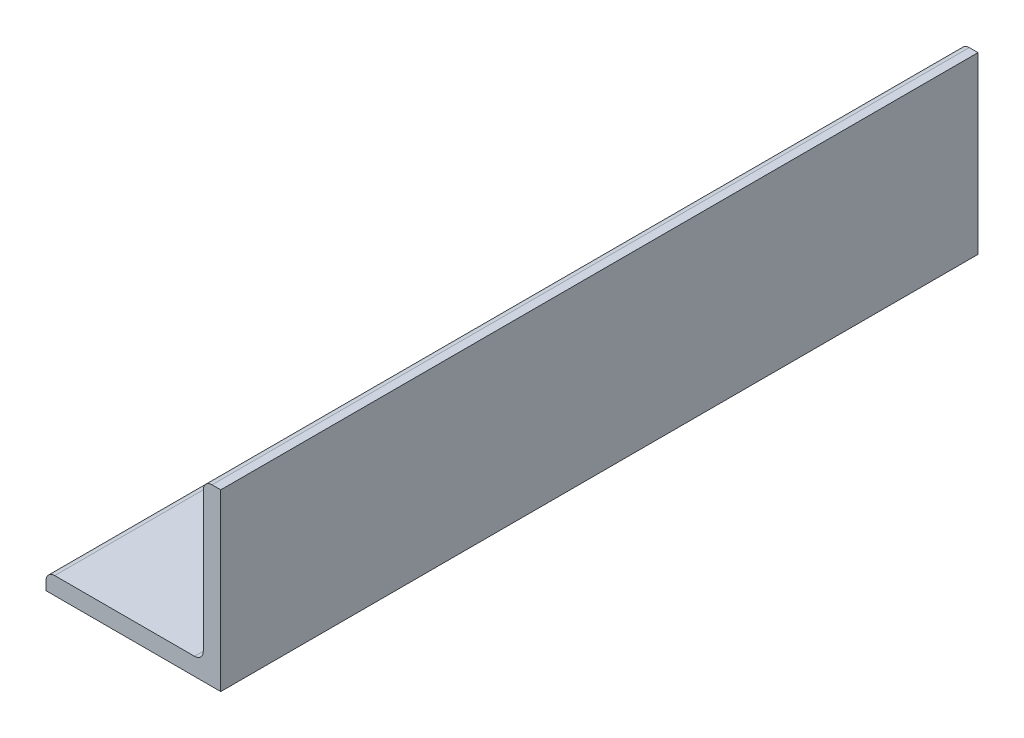
ISO-10303-21;
HEADER;
FILE_DESCRIPTION(('STEP AP214'),'2;1');
FILE_NAME('part.step','',(''),(''),'','','');
FILE_SCHEMA(('AUTOMOTIVE_DESIGN { 1 0 10303 214 1 1 1 1 }'));
ENDSEC;
DATA;
#1=APPLICATION_CONTEXT('core data for automotive mechanical design processes');
#2=APPLICATION_PROTOCOL_DEFINITION('international standard','automotive_design',2000,#1);
#3=PRODUCT_CONTEXT('',#1,'mechanical');
#4=PRODUCT('Part','Part','',(#3));
#5=PRODUCT_RELATED_PRODUCT_CATEGORY('part','',(#4));
#6=PRODUCT_DEFINITION_FORMATION('','',#4);
#7=PRODUCT_DEFINITION_CONTEXT('part definition',#1,'design');
#8=PRODUCT_DEFINITION('design','',#6,#7);
#9=PRODUCT_DEFINITION_SHAPE('','',#8);
#10=(LENGTH_UNIT() NAMED_UNIT(*) SI_UNIT(.MILLI.,.METRE.));
#11=(NAMED_UNIT(*) PLANE_ANGLE_UNIT() SI_UNIT($,.RADIAN.));
#12=(NAMED_UNIT(*) SI_UNIT($,.STERADIAN.) SOLID_ANGLE_UNIT());
#13=UNCERTAINTY_MEASURE_WITH_UNIT(LENGTH_MEASURE(1.E-05),#10,'distance_accuracy_value','');
#14=(GEOMETRIC_REPRESENTATION_CONTEXT(3) GLOBAL_UNCERTAINTY_ASSIGNED_CONTEXT((#13)) GLOBAL_UNIT_ASSIGNED_CONTEXT((#10,
#11,#12)) REPRESENTATION_CONTEXT('',''));
#15=CARTESIAN_POINT('',(0.,0.,0.));
#16=DIRECTION('',(0.,0.,1.));
#17=DIRECTION('',(1.,0.,0.));
#18=AXIS2_PLACEMENT_3D('',#15,#16,#17);
#19=CARTESIAN_POINT('',(-137.100940306666,27.,130.));
#20=DIRECTION('',(0.,-1.,0.));
#21=DIRECTION('',(0.,0.,-1.));
#22=AXIS2_PLACEMENT_3D('',#19,#20,#21);
#23=PLANE('',#22);
#24=DIRECTION('',(-1.,0.,0.));
#25=VECTOR('',#24,1.);
#26=CARTESIAN_POINT('',(-137.100940306666,27.,0.));
#27=LINE('',#26,#25);
#28=CARTESIAN_POINT('',(-135.600940306666,27.,0.));
#29=VERTEX_POINT('',#28);
#30=CARTESIAN_POINT('',(-137.100940306666,27.,0.));
#31=VERTEX_POINT('',#30);
#32=EDGE_CURVE('E135',#29,#31,#27,.T.);
#33=ORIENTED_EDGE('',*,*,#32,.T.);
#34=DIRECTION('',(0.,0.,-1.));
#35=VECTOR('',#34,1.);
#36=CARTESIAN_POINT('',(-137.100940306666,27.,130.));
#37=LINE('',#36,#35);
#38=CARTESIAN_POINT('',(-137.100940306666,27.,130.));
#39=VERTEX_POINT('',#38);
#40=EDGE_CURVE('E11',#39,#31,#37,.T.);
#41=ORIENTED_EDGE('',*,*,#40,.F.);
#42=DIRECTION('',(-1.,0.,0.));
#43=VECTOR('',#42,1.);
#44=CARTESIAN_POINT('',(-137.100940306666,27.,130.));
#45=LINE('',#44,#43);
#46=CARTESIAN_POINT('',(-135.600940306666,27.,130.));
#47=VERTEX_POINT('',#46);
#48=EDGE_CURVE('E151',#47,#39,#45,.T.);
#49=ORIENTED_EDGE('',*,*,#48,.F.);
#50=DIRECTION('',(0.,0.,-1.));
#51=VECTOR('',#50,1.);
#52=CARTESIAN_POINT('',(-135.600940306666,27.,130.));
#53=LINE('',#52,#51);
#54=EDGE_CURVE('E131',#47,#29,#53,.T.);
#55=ORIENTED_EDGE('',*,*,#54,.T.);
#56=EDGE_LOOP('',(#33,#41,#49,#55));
#57=FACE_BOUND('',#56,.T.);
#58=ADVANCED_FACE('F33',(#57),#23,.F.);
#59=CARTESIAN_POINT('',(-137.100940306666,25.5,130.));
#60=DIRECTION('',(0.,0.,-1.));
#61=DIRECTION('',(-1.,0.,0.));
#62=AXIS2_PLACEMENT_3D('',#59,#60,#61);
#63=CYLINDRICAL_SURFACE('',#62,1.5);
#64=CARTESIAN_POINT('',(-137.100940306666,25.5,0.));
#65=DIRECTION('',(0.,0.,1.));
#66=DIRECTION('',(-1.,0.,0.));
#67=AXIS2_PLACEMENT_3D('',#64,#65,#66);
#68=CIRCLE('',#67,1.5);
#69=CARTESIAN_POINT('',(-138.600940306666,25.5,0.));
#70=VERTEX_POINT('',#69);
#71=EDGE_CURVE('E138',#31,#70,#68,.T.);
#72=ORIENTED_EDGE('',*,*,#71,.T.);
#73=DIRECTION('',(0.,0.,-1.));
#74=VECTOR('',#73,1.);
#75=CARTESIAN_POINT('',(-138.600940306666,25.5,130.));
#76=LINE('',#75,#74);
#77=CARTESIAN_POINT('',(-138.600940306666,25.5,130.));
#78=VERTEX_POINT('',#77);
#79=EDGE_CURVE('E41',#78,#70,#76,.T.);
#80=ORIENTED_EDGE('',*,*,#79,.F.);
#81=CARTESIAN_POINT('',(-137.100940306666,25.5,130.));
#82=DIRECTION('',(0.,0.,1.));
#83=DIRECTION('',(-1.,0.,0.));
#84=AXIS2_PLACEMENT_3D('',#81,#82,#83);
#85=CIRCLE('',#84,1.5);
#86=EDGE_CURVE('E95',#39,#78,#85,.T.);
#87=ORIENTED_EDGE('',*,*,#86,.F.);
#88=ORIENTED_EDGE('',*,*,#40,.T.);
#89=EDGE_LOOP('',(#72,#80,#87,#88));
#90=FACE_BOUND('',#89,.T.);
#91=ADVANCED_FACE('F194',(#90),#63,.T.);
#92=CARTESIAN_POINT('',(-138.600940306666,1.50000000000001,130.));
#93=DIRECTION('',(1.,0.,0.));
#94=DIRECTION('',(0.,0.,-1.));
#95=AXIS2_PLACEMENT_3D('',#92,#93,#94);
#96=PLANE('',#95);
#97=DIRECTION('',(0.,-1.,0.));
#98=VECTOR('',#97,1.);
#99=CARTESIAN_POINT('',(-138.600940306666,1.50000000000001,0.));
#100=LINE('',#99,#98);
#101=CARTESIAN_POINT('',(-138.600940306666,1.5,0.));
#102=VERTEX_POINT('',#101);
#103=EDGE_CURVE('E140',#70,#102,#100,.T.);
#104=ORIENTED_EDGE('',*,*,#103,.T.);
#105=DIRECTION('',(0.,0.,-1.));
#106=VECTOR('',#105,1.);
#107=CARTESIAN_POINT('',(-138.600940306666,1.5,130.));
#108=LINE('',#107,#106);
#109=CARTESIAN_POINT('',(-138.600940306666,1.5,130.));
#110=VERTEX_POINT('',#109);
#111=EDGE_CURVE('E161',#110,#102,#108,.T.);
#112=ORIENTED_EDGE('',*,*,#111,.F.);
#113=DIRECTION('',(0.,-1.,0.));
#114=VECTOR('',#113,1.);
#115=CARTESIAN_POINT('',(-138.600940306666,1.50000000000001,130.));
#116=LINE('',#115,#114);
#117=EDGE_CURVE('E169',#78,#110,#116,.T.);
#118=ORIENTED_EDGE('',*,*,#117,.F.);
#119=ORIENTED_EDGE('',*,*,#79,.T.);
#120=EDGE_LOOP('',(#104,#112,#118,#119));
#121=FACE_BOUND('',#120,.T.);
#122=ADVANCED_FACE('F167',(#121),#96,.F.);
#123=CARTESIAN_POINT('',(-140.100940306666,1.5,130.));
#124=DIRECTION('',(0.,0.,-1.));
#125=DIRECTION('',(-1.,0.,0.));
#126=AXIS2_PLACEMENT_3D('',#123,#124,#125);
#127=CYLINDRICAL_SURFACE('',#126,1.5);
#128=CARTESIAN_POINT('',(-140.100940306666,1.5,0.));
#129=DIRECTION('',(0.,0.,-1.));
#130=DIRECTION('',(1.,0.,0.));
#131=AXIS2_PLACEMENT_3D('',#128,#129,#130);
#132=CIRCLE('',#131,1.5);
#133=CARTESIAN_POINT('',(-140.100940306666,0.,0.));
#134=VERTEX_POINT('',#133);
#135=EDGE_CURVE('E142',#102,#134,#132,.T.);
#136=ORIENTED_EDGE('',*,*,#135,.T.);
#137=DIRECTION('',(0.,0.,-1.));
#138=VECTOR('',#137,1.);
#139=CARTESIAN_POINT('',(-140.100940306666,0.,130.));
#140=LINE('',#139,#138);
#141=CARTESIAN_POINT('',(-140.100940306666,0.,130.));
#142=VERTEX_POINT('',#141);
#143=EDGE_CURVE('E158',#142,#134,#140,.T.);
#144=ORIENTED_EDGE('',*,*,#143,.F.);
#145=CARTESIAN_POINT('',(-140.100940306666,1.5,130.));
#146=DIRECTION('',(0.,0.,-1.));
#147=DIRECTION('',(1.,0.,0.));
#148=AXIS2_PLACEMENT_3D('',#145,#146,#147);
#149=CIRCLE('',#148,1.5);
#150=EDGE_CURVE('E185',#110,#142,#149,.T.);
#151=ORIENTED_EDGE('',*,*,#150,.F.);
#152=ORIENTED_EDGE('',*,*,#111,.T.);
#153=EDGE_LOOP('',(#136,#144,#151,#152));
#154=FACE_BOUND('',#153,.T.);
#155=ADVANCED_FACE('F178',(#154),#127,.F.);
#156=CARTESIAN_POINT('',(-164.100940306666,0.,130.));
#157=DIRECTION('',(0.,-1.,0.));
#158=DIRECTION('',(0.,0.,-1.));
#159=AXIS2_PLACEMENT_3D('',#156,#157,#158);
#160=PLANE('',#159);
#161=DIRECTION('',(-1.,0.,0.));
#162=VECTOR('',#161,1.);
#163=CARTESIAN_POINT('',(-164.100940306666,0.,0.));
#164=LINE('',#163,#162);
#165=CARTESIAN_POINT('',(-164.100940306666,0.,0.));
#166=VERTEX_POINT('',#165);
#167=EDGE_CURVE('E144',#134,#166,#164,.T.);
#168=ORIENTED_EDGE('',*,*,#167,.T.);
#169=DIRECTION('',(0.,0.,-1.));
#170=VECTOR('',#169,1.);
#171=CARTESIAN_POINT('',(-164.100940306666,0.,130.));
#172=LINE('',#171,#170);
#173=CARTESIAN_POINT('',(-164.100940306666,0.,130.));
#174=VERTEX_POINT('',#173);
#175=EDGE_CURVE('E155',#174,#166,#172,.T.);
#176=ORIENTED_EDGE('',*,*,#175,.F.);
#177=DIRECTION('',(-1.,0.,0.));
#178=VECTOR('',#177,1.);
#179=CARTESIAN_POINT('',(-164.100940306666,0.,130.));
#180=LINE('',#179,#178);
#181=EDGE_CURVE('E184',#142,#174,#180,.T.);
#182=ORIENTED_EDGE('',*,*,#181,.F.);
#183=ORIENTED_EDGE('',*,*,#143,.T.);
#184=EDGE_LOOP('',(#168,#176,#182,#183));
#185=FACE_BOUND('',#184,.T.);
#186=ADVANCED_FACE('F182',(#185),#160,.F.);
#187=CARTESIAN_POINT('',(-164.100940306666,-1.5,130.));
#188=DIRECTION('',(0.,0.,-1.));
#189=DIRECTION('',(-1.,0.,0.));
#190=AXIS2_PLACEMENT_3D('',#187,#188,#189);
#191=CYLINDRICAL_SURFACE('',#190,1.5);
#192=CARTESIAN_POINT('',(-164.100940306666,-1.5,0.));
#193=DIRECTION('',(0.,0.,1.));
#194=DIRECTION('',(-1.,0.,0.));
#195=AXIS2_PLACEMENT_3D('',#192,#193,#194);
#196=CIRCLE('',#195,1.5);
#197=CARTESIAN_POINT('',(-165.600940306666,-1.50000000000001,0.));
#198=VERTEX_POINT('',#197);
#199=EDGE_CURVE('E146',#166,#198,#196,.T.);
#200=ORIENTED_EDGE('',*,*,#199,.T.);
#201=DIRECTION('',(0.,0.,-1.));
#202=VECTOR('',#201,1.);
#203=CARTESIAN_POINT('',(-165.600940306666,-1.50000000000001,130.));
#204=LINE('',#203,#202);
#205=CARTESIAN_POINT('',(-165.600940306666,-1.50000000000001,130.));
#206=VERTEX_POINT('',#205);
#207=EDGE_CURVE('E126',#206,#198,#204,.T.);
#208=ORIENTED_EDGE('',*,*,#207,.F.);
#209=CARTESIAN_POINT('',(-164.100940306666,-1.5,130.));
#210=DIRECTION('',(0.,0.,1.));
#211=DIRECTION('',(-1.,0.,0.));
#212=AXIS2_PLACEMENT_3D('',#209,#210,#211);
#213=CIRCLE('',#212,1.5);
#214=EDGE_CURVE('E117',#174,#206,#213,.T.);
#215=ORIENTED_EDGE('',*,*,#214,.F.);
#216=ORIENTED_EDGE('',*,*,#175,.T.);
#217=EDGE_LOOP('',(#200,#208,#215,#216));
#218=FACE_BOUND('',#217,.T.);
#219=ADVANCED_FACE('F206',(#218),#191,.T.);
#220=CARTESIAN_POINT('',(-165.600940306666,-3.,130.));
#221=DIRECTION('',(1.,0.,0.));
#222=DIRECTION('',(0.,0.,-1.));
#223=AXIS2_PLACEMENT_3D('',#220,#221,#222);
#224=PLANE('',#223);
#225=DIRECTION('',(0.,-1.,0.));
#226=VECTOR('',#225,1.);
#227=CARTESIAN_POINT('',(-165.600940306666,-3.,0.));
#228=LINE('',#227,#226);
#229=CARTESIAN_POINT('',(-165.600940306666,-3.,0.));
#230=VERTEX_POINT('',#229);
#231=EDGE_CURVE('E125',#198,#230,#228,.T.);
#232=ORIENTED_EDGE('',*,*,#231,.T.);
#233=DIRECTION('',(0.,0.,-1.));
#234=VECTOR('',#233,1.);
#235=CARTESIAN_POINT('',(-165.600940306666,-3.,130.));
#236=LINE('',#235,#234);
#237=CARTESIAN_POINT('',(-165.600940306666,-3.,130.));
#238=VERTEX_POINT('',#237);
#239=EDGE_CURVE('E122',#238,#230,#236,.T.);
#240=ORIENTED_EDGE('',*,*,#239,.F.);
#241=DIRECTION('',(0.,-1.,0.));
#242=VECTOR('',#241,1.);
#243=CARTESIAN_POINT('',(-165.600940306666,-3.,130.));
#244=LINE('',#243,#242);
#245=EDGE_CURVE('E111',#206,#238,#244,.T.);
#246=ORIENTED_EDGE('',*,*,#245,.F.);
#247=ORIENTED_EDGE('',*,*,#207,.T.);
#248=EDGE_LOOP('',(#232,#240,#246,#247));
#249=FACE_BOUND('',#248,.T.);
#250=ADVANCED_FACE('F123',(#249),#224,.F.);
#251=CARTESIAN_POINT('',(-135.600940306666,-3.,130.));
#252=DIRECTION('',(0.,1.,0.));
#253=DIRECTION('',(-1.,0.,0.));
#254=AXIS2_PLACEMENT_3D('',#251,#252,#253);
#255=PLANE('',#254);
#256=DIRECTION('',(1.,0.,0.));
#257=VECTOR('',#256,1.);
#258=CARTESIAN_POINT('',(-135.600940306666,-3.,0.));
#259=LINE('',#258,#257);
#260=CARTESIAN_POINT('',(-135.600940306666,-3.,0.));
#261=VERTEX_POINT('',#260);
#262=EDGE_CURVE('E81',#230,#261,#259,.T.);
#263=ORIENTED_EDGE('',*,*,#262,.T.);
#264=DIRECTION('',(0.,0.,-1.));
#265=VECTOR('',#264,1.);
#266=CARTESIAN_POINT('',(-135.600940306666,-3.,130.));
#267=LINE('',#266,#265);
#268=CARTESIAN_POINT('',(-135.600940306666,-3.,130.));
#269=VERTEX_POINT('',#268);
#270=EDGE_CURVE('E127',#269,#261,#267,.T.);
#271=ORIENTED_EDGE('',*,*,#270,.F.);
#272=DIRECTION('',(1.,0.,0.));
#273=VECTOR('',#272,1.);
#274=CARTESIAN_POINT('',(-135.600940306666,-3.,130.));
#275=LINE('',#274,#273);
#276=EDGE_CURVE('E115',#238,#269,#275,.T.);
#277=ORIENTED_EDGE('',*,*,#276,.F.);
#278=ORIENTED_EDGE('',*,*,#239,.T.);
#279=EDGE_LOOP('',(#263,#271,#277,#278));
#280=FACE_BOUND('',#279,.T.);
#281=ADVANCED_FACE('F129',(#280),#255,.F.);
#282=CARTESIAN_POINT('',(-135.600940306666,27.,130.));
#283=DIRECTION('',(-1.,0.,0.));
#284=DIRECTION('',(0.,0.,1.));
#285=AXIS2_PLACEMENT_3D('',#282,#283,#284);
#286=PLANE('',#285);
#287=DIRECTION('',(0.,1.,0.));
#288=VECTOR('',#287,1.);
#289=CARTESIAN_POINT('',(-135.600940306666,27.,0.));
#290=LINE('',#289,#288);
#291=EDGE_CURVE('E87',#261,#29,#290,.T.);
#292=ORIENTED_EDGE('',*,*,#291,.T.);
#293=ORIENTED_EDGE('',*,*,#54,.F.);
#294=DIRECTION('',(0.,1.,0.));
#295=VECTOR('',#294,1.);
#296=CARTESIAN_POINT('',(-135.600940306666,27.,130.));
#297=LINE('',#296,#295);
#298=EDGE_CURVE('E49',#269,#47,#297,.T.);
#299=ORIENTED_EDGE('',*,*,#298,.F.);
#300=ORIENTED_EDGE('',*,*,#270,.T.);
#301=EDGE_LOOP('',(#292,#293,#299,#300));
#302=FACE_BOUND('',#301,.T.);
#303=ADVANCED_FACE('F214',(#302),#286,.F.);
#304=CARTESIAN_POINT('',(-164.100940306666,-1.5,130.));
#305=DIRECTION('',(0.,0.,-1.));
#306=DIRECTION('',(-1.,0.,0.));
#307=AXIS2_PLACEMENT_3D('',#304,#305,#306);
#308=PLANE('',#307);
#309=ORIENTED_EDGE('',*,*,#48,.T.);
#310=ORIENTED_EDGE('',*,*,#86,.T.);
#311=ORIENTED_EDGE('',*,*,#117,.T.);
#312=ORIENTED_EDGE('',*,*,#150,.T.);
#313=ORIENTED_EDGE('',*,*,#181,.T.);
#314=ORIENTED_EDGE('',*,*,#214,.T.);
#315=ORIENTED_EDGE('',*,*,#245,.T.);
#316=ORIENTED_EDGE('',*,*,#276,.T.);
#317=ORIENTED_EDGE('',*,*,#298,.T.);
#318=EDGE_LOOP('',(#309,#310,#311,#312,#313,#314,#315,#316,#317));
#319=FACE_BOUND('',#318,.T.);
#320=ADVANCED_FACE('F113',(#319),#308,.F.);
#321=CARTESIAN_POINT('',(-164.100940306666,-1.5,0.));
#322=DIRECTION('',(0.,0.,-1.));
#323=DIRECTION('',(-1.,0.,0.));
#324=AXIS2_PLACEMENT_3D('',#321,#322,#323);
#325=PLANE('',#324);
#326=ORIENTED_EDGE('',*,*,#32,.F.);
#327=ORIENTED_EDGE('',*,*,#291,.F.);
#328=ORIENTED_EDGE('',*,*,#262,.F.);
#329=ORIENTED_EDGE('',*,*,#231,.F.);
#330=ORIENTED_EDGE('',*,*,#199,.F.);
#331=ORIENTED_EDGE('',*,*,#167,.F.);
#332=ORIENTED_EDGE('',*,*,#135,.F.);
#333=ORIENTED_EDGE('',*,*,#103,.F.);
#334=ORIENTED_EDGE('',*,*,#71,.F.);
#335=EDGE_LOOP('',(#326,#327,#328,#329,#330,#331,#332,#333,#334));
#336=FACE_BOUND('',#335,.T.);
#337=ADVANCED_FACE('F173',(#336),#325,.T.);
#338=CLOSED_SHELL('',(#58,#91,#122,#155,#186,#219,#250,#281,#303,#320,#337));
#339=MANIFOLD_SOLID_BREP('B2',#338);
#340=ADVANCED_BREP_SHAPE_REPRESENTATION('',(#18,#339),#14);
#341=SHAPE_DEFINITION_REPRESENTATION(#9,#340);
ENDSEC;
END-ISO-10303-21;
